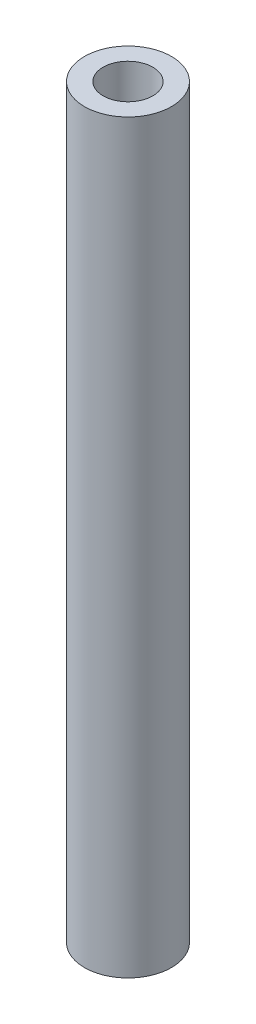
ISO-10303-21;
HEADER;
FILE_DESCRIPTION(('STEP AP214'),'2;1');
FILE_NAME('part.step','',(''),(''),'','','');
FILE_SCHEMA(('AUTOMOTIVE_DESIGN { 1 0 10303 214 1 1 1 1 }'));
ENDSEC;
DATA;
#1=APPLICATION_CONTEXT('core data for automotive mechanical design processes');
#2=APPLICATION_PROTOCOL_DEFINITION('international standard','automotive_design',2000,#1);
#3=PRODUCT_CONTEXT('',#1,'mechanical');
#4=PRODUCT('Part','Part','',(#3));
#5=PRODUCT_RELATED_PRODUCT_CATEGORY('part','',(#4));
#6=PRODUCT_DEFINITION_FORMATION('','',#4);
#7=PRODUCT_DEFINITION_CONTEXT('part definition',#1,'design');
#8=PRODUCT_DEFINITION('design','',#6,#7);
#9=PRODUCT_DEFINITION_SHAPE('','',#8);
#10=(LENGTH_UNIT() NAMED_UNIT(*) SI_UNIT(.MILLI.,.METRE.));
#11=(NAMED_UNIT(*) PLANE_ANGLE_UNIT() SI_UNIT($,.RADIAN.));
#12=(NAMED_UNIT(*) SI_UNIT($,.STERADIAN.) SOLID_ANGLE_UNIT());
#13=UNCERTAINTY_MEASURE_WITH_UNIT(LENGTH_MEASURE(1.E-05),#10,'distance_accuracy_value','');
#14=(GEOMETRIC_REPRESENTATION_CONTEXT(3) GLOBAL_UNCERTAINTY_ASSIGNED_CONTEXT((#13)) GLOBAL_UNIT_ASSIGNED_CONTEXT((#10,
#11,#12)) REPRESENTATION_CONTEXT('',''));
#15=CARTESIAN_POINT('',(0.,0.,0.));
#16=DIRECTION('',(0.,0.,1.));
#17=DIRECTION('',(1.,0.,0.));
#18=AXIS2_PLACEMENT_3D('',#15,#16,#17);
#19=CARTESIAN_POINT('',(0.,30.,0.));
#20=DIRECTION('',(0.,1.,0.));
#21=DIRECTION('',(0.,0.,1.));
#22=AXIS2_PLACEMENT_3D('',#19,#20,#21);
#23=PLANE('',#22);
#24=CARTESIAN_POINT('',(0.,30.,0.));
#25=DIRECTION('',(0.,1.,0.));
#26=DIRECTION('',(0.,0.,1.));
#27=AXIS2_PLACEMENT_3D('',#24,#25,#26);
#28=CIRCLE('',#27,1.75);
#29=CARTESIAN_POINT('',(0.,30.,1.75));
#30=VERTEX_POINT('',#29);
#31=EDGE_CURVE('E10',#30,#30,#28,.T.);
#32=ORIENTED_EDGE('',*,*,#31,.T.);
#33=EDGE_LOOP('',(#32));
#34=FACE_BOUND('',#33,.T.);
#35=CARTESIAN_POINT('',(0.,30.,0.));
#36=DIRECTION('',(0.,1.,0.));
#37=DIRECTION('',(0.,0.,1.));
#38=AXIS2_PLACEMENT_3D('',#35,#36,#37);
#39=CIRCLE('',#38,1.);
#40=CARTESIAN_POINT('',(0.,30.,1.));
#41=VERTEX_POINT('',#40);
#42=EDGE_CURVE('E54',#41,#41,#39,.T.);
#43=ORIENTED_EDGE('',*,*,#42,.F.);
#44=EDGE_LOOP('',(#43));
#45=FACE_BOUND('',#44,.T.);
#46=ADVANCED_FACE('F41',(#34,#45),#23,.T.);
#47=CARTESIAN_POINT('',(0.,0.,0.));
#48=DIRECTION('',(0.,1.,0.));
#49=DIRECTION('',(0.,0.,1.));
#50=AXIS2_PLACEMENT_3D('',#47,#48,#49);
#51=PLANE('',#50);
#52=CARTESIAN_POINT('',(0.,0.,0.));
#53=DIRECTION('',(0.,1.,0.));
#54=DIRECTION('',(0.,0.,1.));
#55=AXIS2_PLACEMENT_3D('',#52,#53,#54);
#56=CIRCLE('',#55,1.75);
#57=CARTESIAN_POINT('',(0.,0.,1.75));
#58=VERTEX_POINT('',#57);
#59=EDGE_CURVE('E45',#58,#58,#56,.T.);
#60=ORIENTED_EDGE('',*,*,#59,.F.);
#61=EDGE_LOOP('',(#60));
#62=FACE_BOUND('',#61,.T.);
#63=CARTESIAN_POINT('',(0.,0.,0.));
#64=DIRECTION('',(0.,1.,0.));
#65=DIRECTION('',(0.,0.,1.));
#66=AXIS2_PLACEMENT_3D('',#63,#64,#65);
#67=CIRCLE('',#66,1.);
#68=CARTESIAN_POINT('',(0.,0.,1.));
#69=VERTEX_POINT('',#68);
#70=EDGE_CURVE('E56',#69,#69,#67,.T.);
#71=ORIENTED_EDGE('',*,*,#70,.T.);
#72=EDGE_LOOP('',(#71));
#73=FACE_BOUND('',#72,.T.);
#74=ADVANCED_FACE('F68',(#62,#73),#51,.F.);
#75=CARTESIAN_POINT('',(0.,30.,0.));
#76=DIRECTION('',(0.,-1.,0.));
#77=DIRECTION('',(0.,0.,-1.));
#78=AXIS2_PLACEMENT_3D('',#75,#76,#77);
#79=CYLINDRICAL_SURFACE('',#78,1.75);
#80=ORIENTED_EDGE('',*,*,#31,.F.);
#81=EDGE_LOOP('',(#80));
#82=FACE_BOUND('',#81,.T.);
#83=ORIENTED_EDGE('',*,*,#59,.T.);
#84=EDGE_LOOP('',(#83));
#85=FACE_BOUND('',#84,.T.);
#86=ADVANCED_FACE('F43',(#82,#85),#79,.T.);
#87=CARTESIAN_POINT('',(0.,30.,0.));
#88=DIRECTION('',(0.,-1.,0.));
#89=DIRECTION('',(0.,0.,-1.));
#90=AXIS2_PLACEMENT_3D('',#87,#88,#89);
#91=CYLINDRICAL_SURFACE('',#90,1.);
#92=ORIENTED_EDGE('',*,*,#42,.T.);
#93=EDGE_LOOP('',(#92));
#94=FACE_BOUND('',#93,.T.);
#95=ORIENTED_EDGE('',*,*,#70,.F.);
#96=EDGE_LOOP('',(#95));
#97=FACE_BOUND('',#96,.T.);
#98=ADVANCED_FACE('F64',(#94,#97),#91,.F.);
#99=CLOSED_SHELL('',(#46,#74,#86,#98));
#100=MANIFOLD_SOLID_BREP('B2',#99);
#101=ADVANCED_BREP_SHAPE_REPRESENTATION('',(#18,#100),#14);
#102=SHAPE_DEFINITION_REPRESENTATION(#9,#101);
ENDSEC;
END-ISO-10303-21;
